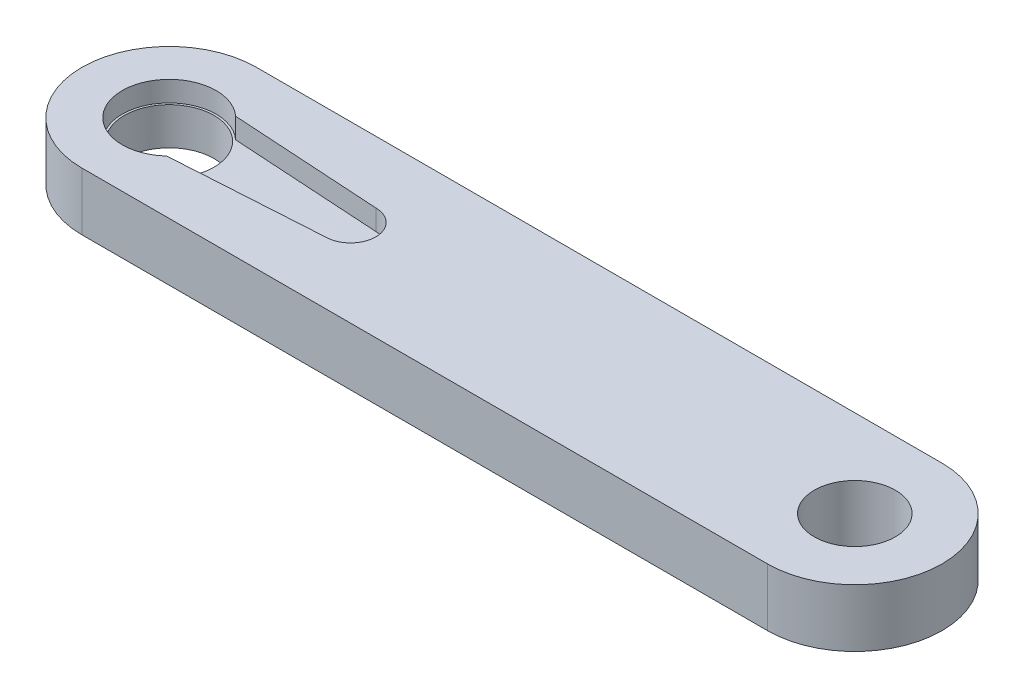
ISO-10303-21;
HEADER;
FILE_DESCRIPTION(('STEP AP214'),'2;1');
FILE_NAME('part.step','',(''),(''),'','','');
FILE_SCHEMA(('AUTOMOTIVE_DESIGN { 1 0 10303 214 1 1 1 1 }'));
ENDSEC;
DATA;
#1=APPLICATION_CONTEXT('core data for automotive mechanical design processes');
#2=APPLICATION_PROTOCOL_DEFINITION('international standard','automotive_design',2000,#1);
#3=PRODUCT_CONTEXT('',#1,'mechanical');
#4=PRODUCT('Part','Part','',(#3));
#5=PRODUCT_RELATED_PRODUCT_CATEGORY('part','',(#4));
#6=PRODUCT_DEFINITION_FORMATION('','',#4);
#7=PRODUCT_DEFINITION_CONTEXT('part definition',#1,'design');
#8=PRODUCT_DEFINITION('design','',#6,#7);
#9=PRODUCT_DEFINITION_SHAPE('','',#8);
#10=(LENGTH_UNIT() NAMED_UNIT(*) SI_UNIT(.MILLI.,.METRE.));
#11=(NAMED_UNIT(*) PLANE_ANGLE_UNIT() SI_UNIT($,.RADIAN.));
#12=(NAMED_UNIT(*) SI_UNIT($,.STERADIAN.) SOLID_ANGLE_UNIT());
#13=UNCERTAINTY_MEASURE_WITH_UNIT(LENGTH_MEASURE(1.E-05),#10,'distance_accuracy_value','');
#14=(GEOMETRIC_REPRESENTATION_CONTEXT(3) GLOBAL_UNCERTAINTY_ASSIGNED_CONTEXT((#13)) GLOBAL_UNIT_ASSIGNED_CONTEXT((#10,
#11,#12)) REPRESENTATION_CONTEXT('',''));
#15=CARTESIAN_POINT('',(0.,0.,0.));
#16=DIRECTION('',(0.,0.,1.));
#17=DIRECTION('',(1.,0.,0.));
#18=AXIS2_PLACEMENT_3D('',#15,#16,#17);
#19=CARTESIAN_POINT('',(55.,3.,0.));
#20=DIRECTION('',(0.,1.,0.));
#21=DIRECTION('',(0.,0.,1.));
#22=AXIS2_PLACEMENT_3D('',#19,#20,#21);
#23=PLANE('',#22);
#24=CARTESIAN_POINT('',(0.,3.,0.));
#25=DIRECTION('',(0.,1.,0.));
#26=DIRECTION('',(0.,0.,1.));
#27=AXIS2_PLACEMENT_3D('',#24,#25,#26);
#28=CIRCLE('',#27,3.6);
#29=CARTESIAN_POINT('',(0.,3.,3.6));
#30=VERTEX_POINT('',#29);
#31=EDGE_CURVE('E180',#30,#30,#28,.T.);
#32=ORIENTED_EDGE('',*,*,#31,.F.);
#33=EDGE_LOOP('',(#32));
#34=FACE_BOUND('',#33,.T.);
#35=DIRECTION('',(0.998071858143405,0.,-0.0620690420593882));
#36=VECTOR('',#35,1.);
#37=CARTESIAN_POINT('',(2.56181844222418,3.,2.76586085497446));
#38=LINE('',#37,#36);
#39=CARTESIAN_POINT('',(2.56181844222418,3.,2.76586085497446));
#40=VERTEX_POINT('',#39);
#41=CARTESIAN_POINT('',(14.5553968890812,3.,2.01999279047927));
#42=VERTEX_POINT('',#41);
#43=EDGE_CURVE('E117',#40,#42,#38,.T.);
#44=ORIENTED_EDGE('',*,*,#43,.T.);
#45=CARTESIAN_POINT('',(14.55,3.,0.));
#46=DIRECTION('',(0.,1.,0.));
#47=DIRECTION('',(0.,0.,1.));
#48=AXIS2_PLACEMENT_3D('',#45,#46,#47);
#49=CIRCLE('',#48,2.02);
#50=CARTESIAN_POINT('',(14.5553968890811,3.,-2.01999279047927));
#51=VERTEX_POINT('',#50);
#52=EDGE_CURVE('E141',#42,#51,#49,.T.);
#53=ORIENTED_EDGE('',*,*,#52,.T.);
#54=DIRECTION('',(-0.998071858143405,0.,-0.0620690420593882));
#55=VECTOR('',#54,1.);
#56=CARTESIAN_POINT('',(14.5553968890811,3.,-2.01999279047927));
#57=LINE('',#56,#55);
#58=CARTESIAN_POINT('',(2.56181844222418,3.,-2.76586085497446));
#59=VERTEX_POINT('',#58);
#60=EDGE_CURVE('E123',#51,#59,#57,.T.);
#61=ORIENTED_EDGE('',*,*,#60,.T.);
#62=CARTESIAN_POINT('',(0.,3.,0.));
#63=DIRECTION('',(0.,1.,0.));
#64=DIRECTION('',(0.,0.,-1.));
#65=AXIS2_PLACEMENT_3D('',#62,#63,#64);
#66=CIRCLE('',#65,3.77);
#67=EDGE_CURVE('E147',#59,#40,#66,.T.);
#68=ORIENTED_EDGE('',*,*,#67,.T.);
#69=EDGE_LOOP('',(#44,#53,#61,#68));
#70=FACE_BOUND('',#69,.T.);
#71=ADVANCED_FACE('F39',(#34,#70),#23,.T.);
#72=CARTESIAN_POINT('',(55.,3.,0.));
#73=DIRECTION('',(0.,-1.,0.));
#74=DIRECTION('',(0.,0.,-1.));
#75=AXIS2_PLACEMENT_3D('',#72,#73,#74);
#76=CYLINDRICAL_SURFACE('',#75,7.);
#77=CARTESIAN_POINT('',(55.,0.,0.));
#78=DIRECTION('',(0.,1.,0.));
#79=DIRECTION('',(0.,0.,1.));
#80=AXIS2_PLACEMENT_3D('',#77,#78,#79);
#81=CIRCLE('',#80,7.);
#82=CARTESIAN_POINT('',(55.,0.,7.));
#83=VERTEX_POINT('',#82);
#84=CARTESIAN_POINT('',(55.,0.,-7.));
#85=VERTEX_POINT('',#84);
#86=EDGE_CURVE('E184',#83,#85,#81,.T.);
#87=ORIENTED_EDGE('',*,*,#86,.T.);
#88=DIRECTION('',(0.,-1.,0.));
#89=VECTOR('',#88,1.);
#90=CARTESIAN_POINT('',(55.,3.,-7.));
#91=LINE('',#90,#89);
#92=CARTESIAN_POINT('',(55.,4.64,-7.));
#93=VERTEX_POINT('',#92);
#94=EDGE_CURVE('E11',#93,#85,#91,.T.);
#95=ORIENTED_EDGE('',*,*,#94,.F.);
#96=CARTESIAN_POINT('',(55.,4.64,0.));
#97=DIRECTION('',(0.,1.,0.));
#98=DIRECTION('',(0.,0.,1.));
#99=AXIS2_PLACEMENT_3D('',#96,#97,#98);
#100=CIRCLE('',#99,7.);
#101=CARTESIAN_POINT('',(55.,4.64,7.));
#102=VERTEX_POINT('',#101);
#103=EDGE_CURVE('E168',#102,#93,#100,.T.);
#104=ORIENTED_EDGE('',*,*,#103,.F.);
#105=DIRECTION('',(0.,-1.,0.));
#106=VECTOR('',#105,1.);
#107=CARTESIAN_POINT('',(55.,3.,7.));
#108=LINE('',#107,#106);
#109=EDGE_CURVE('E196',#102,#83,#108,.T.);
#110=ORIENTED_EDGE('',*,*,#109,.T.);
#111=EDGE_LOOP('',(#87,#95,#104,#110));
#112=FACE_BOUND('',#111,.T.);
#113=ADVANCED_FACE('F41',(#112),#76,.T.);
#114=CARTESIAN_POINT('',(0.,3.,-7.));
#115=DIRECTION('',(0.,0.,1.));
#116=DIRECTION('',(1.,0.,0.));
#117=AXIS2_PLACEMENT_3D('',#114,#115,#116);
#118=PLANE('',#117);
#119=DIRECTION('',(-1.,0.,0.));
#120=VECTOR('',#119,1.);
#121=CARTESIAN_POINT('',(0.,0.,-7.));
#122=LINE('',#121,#120);
#123=CARTESIAN_POINT('',(0.,0.,-7.));
#124=VERTEX_POINT('',#123);
#125=EDGE_CURVE('E188',#85,#124,#122,.T.);
#126=ORIENTED_EDGE('',*,*,#125,.T.);
#127=DIRECTION('',(0.,-1.,0.));
#128=VECTOR('',#127,1.);
#129=CARTESIAN_POINT('',(0.,3.,-7.));
#130=LINE('',#129,#128);
#131=CARTESIAN_POINT('',(0.,4.64,-7.));
#132=VERTEX_POINT('',#131);
#133=EDGE_CURVE('E48',#132,#124,#130,.T.);
#134=ORIENTED_EDGE('',*,*,#133,.F.);
#135=DIRECTION('',(-1.,0.,0.));
#136=VECTOR('',#135,1.);
#137=CARTESIAN_POINT('',(55.,4.64,-7.));
#138=LINE('',#137,#136);
#139=EDGE_CURVE('E172',#93,#132,#138,.T.);
#140=ORIENTED_EDGE('',*,*,#139,.F.);
#141=ORIENTED_EDGE('',*,*,#94,.T.);
#142=EDGE_LOOP('',(#126,#134,#140,#141));
#143=FACE_BOUND('',#142,.T.);
#144=ADVANCED_FACE('F217',(#143),#118,.F.);
#145=CARTESIAN_POINT('',(0.,3.,0.));
#146=DIRECTION('',(0.,-1.,0.));
#147=DIRECTION('',(0.,0.,-1.));
#148=AXIS2_PLACEMENT_3D('',#145,#146,#147);
#149=CYLINDRICAL_SURFACE('',#148,7.);
#150=CARTESIAN_POINT('',(0.,0.,0.));
#151=DIRECTION('',(0.,1.,0.));
#152=DIRECTION('',(0.,0.,1.));
#153=AXIS2_PLACEMENT_3D('',#150,#151,#152);
#154=CIRCLE('',#153,7.);
#155=CARTESIAN_POINT('',(0.,0.,7.));
#156=VERTEX_POINT('',#155);
#157=EDGE_CURVE('E191',#124,#156,#154,.T.);
#158=ORIENTED_EDGE('',*,*,#157,.T.);
#159=DIRECTION('',(0.,-1.,0.));
#160=VECTOR('',#159,1.);
#161=CARTESIAN_POINT('',(0.,3.,7.));
#162=LINE('',#161,#160);
#163=CARTESIAN_POINT('',(0.,4.64,7.));
#164=VERTEX_POINT('',#163);
#165=EDGE_CURVE('E199',#164,#156,#162,.T.);
#166=ORIENTED_EDGE('',*,*,#165,.F.);
#167=CARTESIAN_POINT('',(0.,4.64,0.));
#168=DIRECTION('',(0.,1.,0.));
#169=DIRECTION('',(0.,0.,1.));
#170=AXIS2_PLACEMENT_3D('',#167,#168,#169);
#171=CIRCLE('',#170,7.);
#172=EDGE_CURVE('E125',#132,#164,#171,.T.);
#173=ORIENTED_EDGE('',*,*,#172,.F.);
#174=ORIENTED_EDGE('',*,*,#133,.T.);
#175=EDGE_LOOP('',(#158,#166,#173,#174));
#176=FACE_BOUND('',#175,.T.);
#177=ADVANCED_FACE('F206',(#176),#149,.T.);
#178=CARTESIAN_POINT('',(0.,3.,7.));
#179=DIRECTION('',(0.,0.,-1.));
#180=DIRECTION('',(-1.,0.,0.));
#181=AXIS2_PLACEMENT_3D('',#178,#179,#180);
#182=PLANE('',#181);
#183=DIRECTION('',(1.,0.,0.));
#184=VECTOR('',#183,1.);
#185=CARTESIAN_POINT('',(0.,0.,7.));
#186=LINE('',#185,#184);
#187=EDGE_CURVE('E63',#156,#83,#186,.T.);
#188=ORIENTED_EDGE('',*,*,#187,.T.);
#189=ORIENTED_EDGE('',*,*,#109,.F.);
#190=DIRECTION('',(1.,0.,0.));
#191=VECTOR('',#190,1.);
#192=CARTESIAN_POINT('',(0.,4.64,7.));
#193=LINE('',#192,#191);
#194=EDGE_CURVE('E164',#164,#102,#193,.T.);
#195=ORIENTED_EDGE('',*,*,#194,.F.);
#196=ORIENTED_EDGE('',*,*,#165,.T.);
#197=EDGE_LOOP('',(#188,#189,#195,#196));
#198=FACE_BOUND('',#197,.T.);
#199=ADVANCED_FACE('F215',(#198),#182,.F.);
#200=CARTESIAN_POINT('',(55.,0.,0.));
#201=DIRECTION('',(0.,1.,0.));
#202=DIRECTION('',(0.,0.,1.));
#203=AXIS2_PLACEMENT_3D('',#200,#201,#202);
#204=PLANE('',#203);
#205=CARTESIAN_POINT('',(55.,0.,0.));
#206=DIRECTION('',(0.,1.,0.));
#207=DIRECTION('',(0.,0.,1.));
#208=AXIS2_PLACEMENT_3D('',#205,#206,#207);
#209=CIRCLE('',#208,3.25);
#210=CARTESIAN_POINT('',(55.,0.,3.25));
#211=VERTEX_POINT('',#210);
#212=EDGE_CURVE('E144',#211,#211,#209,.F.);
#213=ORIENTED_EDGE('',*,*,#212,.F.);
#214=EDGE_LOOP('',(#213));
#215=FACE_BOUND('',#214,.T.);
#216=CARTESIAN_POINT('',(0.,0.,0.));
#217=DIRECTION('',(0.,-1.,0.));
#218=DIRECTION('',(0.,0.,-1.));
#219=AXIS2_PLACEMENT_3D('',#216,#217,#218);
#220=CIRCLE('',#219,3.6);
#221=CARTESIAN_POINT('',(0.,0.,-3.6));
#222=VERTEX_POINT('',#221);
#223=EDGE_CURVE('E176',#222,#222,#220,.T.);
#224=ORIENTED_EDGE('',*,*,#223,.F.);
#225=EDGE_LOOP('',(#224));
#226=FACE_BOUND('',#225,.T.);
#227=ORIENTED_EDGE('',*,*,#86,.F.);
#228=ORIENTED_EDGE('',*,*,#187,.F.);
#229=ORIENTED_EDGE('',*,*,#157,.F.);
#230=ORIENTED_EDGE('',*,*,#125,.F.);
#231=EDGE_LOOP('',(#227,#228,#229,#230));
#232=FACE_BOUND('',#231,.T.);
#233=ADVANCED_FACE('F211',(#215,#226,#232),#204,.F.);
#234=CARTESIAN_POINT('',(0.,3.95,0.));
#235=DIRECTION('',(0.,-1.,0.));
#236=DIRECTION('',(0.,0.,-1.));
#237=AXIS2_PLACEMENT_3D('',#234,#235,#236);
#238=CYLINDRICAL_SURFACE('',#237,3.6);
#239=ORIENTED_EDGE('',*,*,#31,.T.);
#240=EDGE_LOOP('',(#239));
#241=FACE_BOUND('',#240,.T.);
#242=ORIENTED_EDGE('',*,*,#223,.T.);
#243=EDGE_LOOP('',(#242));
#244=FACE_BOUND('',#243,.T.);
#245=ADVANCED_FACE('F233',(#241,#244),#238,.F.);
#246=CARTESIAN_POINT('',(0.,4.64,0.));
#247=DIRECTION('',(0.,1.,0.));
#248=DIRECTION('',(0.,0.,1.));
#249=AXIS2_PLACEMENT_3D('',#246,#247,#248);
#250=PLANE('',#249);
#251=CARTESIAN_POINT('',(55.,4.64,0.));
#252=DIRECTION('',(0.,1.,0.));
#253=DIRECTION('',(0.,0.,1.));
#254=AXIS2_PLACEMENT_3D('',#251,#252,#253);
#255=CIRCLE('',#254,3.25);
#256=CARTESIAN_POINT('',(55.,4.64,3.25));
#257=VERTEX_POINT('',#256);
#258=EDGE_CURVE('E349',#257,#257,#255,.T.);
#259=ORIENTED_EDGE('',*,*,#258,.F.);
#260=EDGE_LOOP('',(#259));
#261=FACE_BOUND('',#260,.T.);
#262=ORIENTED_EDGE('',*,*,#172,.T.);
#263=ORIENTED_EDGE('',*,*,#194,.T.);
#264=ORIENTED_EDGE('',*,*,#103,.T.);
#265=ORIENTED_EDGE('',*,*,#139,.T.);
#266=EDGE_LOOP('',(#262,#263,#264,#265));
#267=FACE_BOUND('',#266,.T.);
#268=DIRECTION('',(-0.998071858143405,0.,-0.0620690420593882));
#269=VECTOR('',#268,1.);
#270=CARTESIAN_POINT('',(14.5553968890811,4.64,-2.01999279047927));
#271=LINE('',#270,#269);
#272=CARTESIAN_POINT('',(14.5553968890811,4.64,-2.01999279047927));
#273=VERTEX_POINT('',#272);
#274=CARTESIAN_POINT('',(2.56181844222418,4.64,-2.76586085497446));
#275=VERTEX_POINT('',#274);
#276=EDGE_CURVE('E116',#273,#275,#271,.T.);
#277=ORIENTED_EDGE('',*,*,#276,.F.);
#278=CARTESIAN_POINT('',(14.55,4.64,0.));
#279=DIRECTION('',(0.,1.,0.));
#280=DIRECTION('',(0.,0.,1.));
#281=AXIS2_PLACEMENT_3D('',#278,#279,#280);
#282=CIRCLE('',#281,2.02);
#283=CARTESIAN_POINT('',(14.5553968890812,4.64,2.01999279047927));
#284=VERTEX_POINT('',#283);
#285=EDGE_CURVE('E107',#284,#273,#282,.T.);
#286=ORIENTED_EDGE('',*,*,#285,.F.);
#287=DIRECTION('',(0.998071858143405,0.,-0.0620690420593882));
#288=VECTOR('',#287,1.);
#289=CARTESIAN_POINT('',(2.56181844222418,4.64,2.76586085497446));
#290=LINE('',#289,#288);
#291=CARTESIAN_POINT('',(2.56181844222418,4.64,2.76586085497446));
#292=VERTEX_POINT('',#291);
#293=EDGE_CURVE('E135',#292,#284,#290,.T.);
#294=ORIENTED_EDGE('',*,*,#293,.F.);
#295=CARTESIAN_POINT('',(0.,4.64,0.));
#296=DIRECTION('',(0.,1.,0.));
#297=DIRECTION('',(0.,0.,-1.));
#298=AXIS2_PLACEMENT_3D('',#295,#296,#297);
#299=CIRCLE('',#298,3.77);
#300=EDGE_CURVE('E131',#275,#292,#299,.T.);
#301=ORIENTED_EDGE('',*,*,#300,.F.);
#302=EDGE_LOOP('',(#277,#286,#294,#301));
#303=FACE_BOUND('',#302,.T.);
#304=ADVANCED_FACE('F129',(#261,#267,#303),#250,.T.);
#305=CARTESIAN_POINT('',(14.55,4.64,0.));
#306=DIRECTION('',(0.,-1.,0.));
#307=DIRECTION('',(0.,0.,-1.));
#308=AXIS2_PLACEMENT_3D('',#305,#306,#307);
#309=CYLINDRICAL_SURFACE('',#308,2.02);
#310=ORIENTED_EDGE('',*,*,#52,.F.);
#311=DIRECTION('',(0.,-1.,0.));
#312=VECTOR('',#311,1.);
#313=CARTESIAN_POINT('',(14.5553968890812,4.64,2.01999279047927));
#314=LINE('',#313,#312);
#315=EDGE_CURVE('E55',#284,#42,#314,.T.);
#316=ORIENTED_EDGE('',*,*,#315,.F.);
#317=ORIENTED_EDGE('',*,*,#285,.T.);
#318=DIRECTION('',(0.,-1.,0.));
#319=VECTOR('',#318,1.);
#320=CARTESIAN_POINT('',(14.5553968890811,4.64,-2.01999279047927));
#321=LINE('',#320,#319);
#322=EDGE_CURVE('E110',#273,#51,#321,.T.);
#323=ORIENTED_EDGE('',*,*,#322,.T.);
#324=EDGE_LOOP('',(#310,#316,#317,#323));
#325=FACE_BOUND('',#324,.T.);
#326=ADVANCED_FACE('F109',(#325),#309,.F.);
#327=CARTESIAN_POINT('',(14.5553968890811,4.64,-2.01999279047927));
#328=DIRECTION('',(-0.0620690420593882,0.,0.998071858143405));
#329=DIRECTION('',(0.998071858143405,0.,0.0620690420593882));
#330=AXIS2_PLACEMENT_3D('',#327,#328,#329);
#331=PLANE('',#330);
#332=ORIENTED_EDGE('',*,*,#60,.F.);
#333=ORIENTED_EDGE('',*,*,#322,.F.);
#334=ORIENTED_EDGE('',*,*,#276,.T.);
#335=DIRECTION('',(0.,-1.,0.));
#336=VECTOR('',#335,1.);
#337=CARTESIAN_POINT('',(2.56181844222418,4.64,-2.76586085497446));
#338=LINE('',#337,#336);
#339=EDGE_CURVE('E126',#275,#59,#338,.T.);
#340=ORIENTED_EDGE('',*,*,#339,.T.);
#341=EDGE_LOOP('',(#332,#333,#334,#340));
#342=FACE_BOUND('',#341,.T.);
#343=ADVANCED_FACE('F120',(#342),#331,.T.);
#344=CARTESIAN_POINT('',(0.,4.64,0.));
#345=DIRECTION('',(0.,-1.,0.));
#346=DIRECTION('',(0.,0.,-1.));
#347=AXIS2_PLACEMENT_3D('',#344,#345,#346);
#348=CYLINDRICAL_SURFACE('',#347,3.77);
#349=ORIENTED_EDGE('',*,*,#67,.F.);
#350=ORIENTED_EDGE('',*,*,#339,.F.);
#351=ORIENTED_EDGE('',*,*,#300,.T.);
#352=DIRECTION('',(0.,-1.,0.));
#353=VECTOR('',#352,1.);
#354=CARTESIAN_POINT('',(2.56181844222418,4.64,2.76586085497446));
#355=LINE('',#354,#353);
#356=EDGE_CURVE('E156',#292,#40,#355,.T.);
#357=ORIENTED_EDGE('',*,*,#356,.T.);
#358=EDGE_LOOP('',(#349,#350,#351,#357));
#359=FACE_BOUND('',#358,.T.);
#360=ADVANCED_FACE('F273',(#359),#348,.F.);
#361=CARTESIAN_POINT('',(2.56181844222418,4.64,2.76586085497446));
#362=DIRECTION('',(-0.0620690420593882,0.,-0.998071858143405));
#363=DIRECTION('',(-0.998071858143405,0.,0.0620690420593882));
#364=AXIS2_PLACEMENT_3D('',#361,#362,#363);
#365=PLANE('',#364);
#366=ORIENTED_EDGE('',*,*,#43,.F.);
#367=ORIENTED_EDGE('',*,*,#356,.F.);
#368=ORIENTED_EDGE('',*,*,#293,.T.);
#369=ORIENTED_EDGE('',*,*,#315,.T.);
#370=EDGE_LOOP('',(#366,#367,#368,#369));
#371=FACE_BOUND('',#370,.T.);
#372=ADVANCED_FACE('F280',(#371),#365,.T.);
#373=CARTESIAN_POINT('',(55.,-9.19238815542512,0.));
#374=DIRECTION('',(0.,1.,0.));
#375=DIRECTION('',(0.,0.,1.));
#376=AXIS2_PLACEMENT_3D('',#373,#374,#375);
#377=CYLINDRICAL_SURFACE('',#376,3.25);
#378=ORIENTED_EDGE('',*,*,#212,.T.);
#379=EDGE_LOOP('',(#378));
#380=FACE_BOUND('',#379,.T.);
#381=ORIENTED_EDGE('',*,*,#258,.T.);
#382=EDGE_LOOP('',(#381));
#383=FACE_BOUND('',#382,.T.);
#384=ADVANCED_FACE('F287',(#380,#383),#377,.F.);
#385=CLOSED_SHELL('',(#71,#113,#144,#177,#199,#233,#245,#304,#326,#343,#360,#372,#384));
#386=MANIFOLD_SOLID_BREP('B2',#385);
#387=ADVANCED_BREP_SHAPE_REPRESENTATION('',(#18,#386),#14);
#388=SHAPE_DEFINITION_REPRESENTATION(#9,#387);
ENDSEC;
END-ISO-10303-21;
